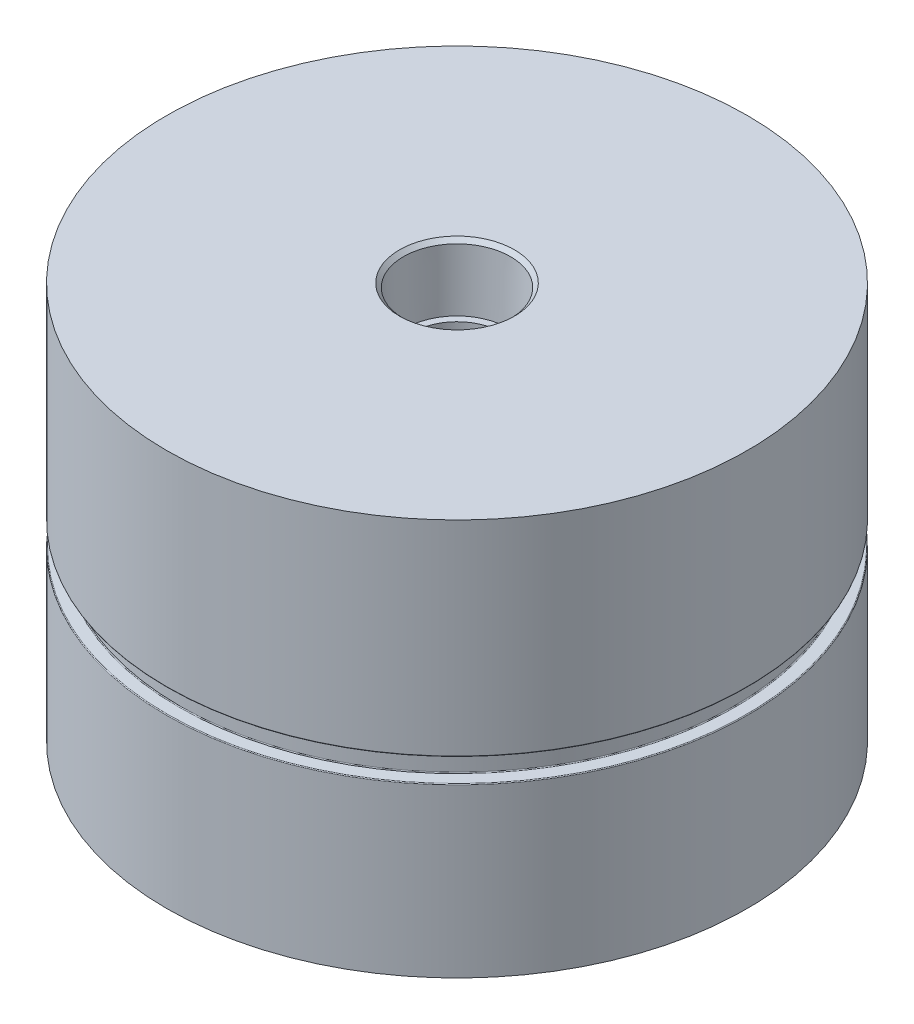
ISO-10303-21;
HEADER;
FILE_DESCRIPTION(('STEP AP214'),'2;1');
FILE_NAME('part.step','',(''),(''),'','','');
FILE_SCHEMA(('AUTOMOTIVE_DESIGN { 1 0 10303 214 1 1 1 1 }'));
ENDSEC;
DATA;
#1=APPLICATION_CONTEXT('core data for automotive mechanical design processes');
#2=APPLICATION_PROTOCOL_DEFINITION('international standard','automotive_design',2000,#1);
#3=PRODUCT_CONTEXT('',#1,'mechanical');
#4=PRODUCT('Part','Part','',(#3));
#5=PRODUCT_RELATED_PRODUCT_CATEGORY('part','',(#4));
#6=PRODUCT_DEFINITION_FORMATION('','',#4);
#7=PRODUCT_DEFINITION_CONTEXT('part definition',#1,'design');
#8=PRODUCT_DEFINITION('design','',#6,#7);
#9=PRODUCT_DEFINITION_SHAPE('','',#8);
#10=(LENGTH_UNIT() NAMED_UNIT(*) SI_UNIT(.MILLI.,.METRE.));
#11=(NAMED_UNIT(*) PLANE_ANGLE_UNIT() SI_UNIT($,.RADIAN.));
#12=(NAMED_UNIT(*) SI_UNIT($,.STERADIAN.) SOLID_ANGLE_UNIT());
#13=UNCERTAINTY_MEASURE_WITH_UNIT(LENGTH_MEASURE(1.E-05),#10,'distance_accuracy_value','');
#14=(GEOMETRIC_REPRESENTATION_CONTEXT(3) GLOBAL_UNCERTAINTY_ASSIGNED_CONTEXT((#13)) GLOBAL_UNIT_ASSIGNED_CONTEXT((#10,
#11,#12)) REPRESENTATION_CONTEXT('',''));
#15=CARTESIAN_POINT('',(0.,0.,0.));
#16=DIRECTION('',(0.,0.,1.));
#17=DIRECTION('',(1.,0.,0.));
#18=AXIS2_PLACEMENT_3D('',#15,#16,#17);
#19=CARTESIAN_POINT('',(0.,-33.4044212771882,0.));
#20=DIRECTION('',(0.,-1.,0.));
#21=DIRECTION('',(0.,0.,-1.));
#22=AXIS2_PLACEMENT_3D('',#19,#20,#21);
#23=PLANE('',#22);
#24=CARTESIAN_POINT('',(0.,-33.4044212771882,0.));
#25=DIRECTION('',(0.,1.,0.));
#26=DIRECTION('',(0.,0.,1.));
#27=AXIS2_PLACEMENT_3D('',#24,#25,#26);
#28=CIRCLE('',#27,7.1374);
#29=CARTESIAN_POINT('',(0.,-33.4044212771882,7.1374));
#30=VERTEX_POINT('',#29);
#31=EDGE_CURVE('E71',#30,#30,#28,.T.);
#32=ORIENTED_EDGE('',*,*,#31,.T.);
#33=EDGE_LOOP('',(#32));
#34=FACE_BOUND('',#33,.T.);
#35=CARTESIAN_POINT('',(0.,-33.4044212771882,0.));
#36=DIRECTION('',(0.,1.,0.));
#37=DIRECTION('',(0.,0.,1.));
#38=AXIS2_PLACEMENT_3D('',#35,#36,#37);
#39=CIRCLE('',#38,46.4693);
#40=CARTESIAN_POINT('',(0.,-33.4044212771882,46.4693));
#41=VERTEX_POINT('',#40);
#42=EDGE_CURVE('E68',#41,#41,#39,.T.);
#43=ORIENTED_EDGE('',*,*,#42,.F.);
#44=EDGE_LOOP('',(#43));
#45=FACE_BOUND('',#44,.T.);
#46=ADVANCED_FACE('F40',(#34,#45),#23,.T.);
#47=CARTESIAN_POINT('',(0.,32.1894098045235,0.));
#48=DIRECTION('',(0.,1.,0.));
#49=DIRECTION('',(0.,0.,1.));
#50=AXIS2_PLACEMENT_3D('',#47,#48,#49);
#51=CYLINDRICAL_SURFACE('',#50,46.4693);
#52=CARTESIAN_POINT('',(0.,-6.64123970800395,0.));
#53=DIRECTION('',(0.,-1.,0.));
#54=DIRECTION('',(0.,0.,-1.));
#55=AXIS2_PLACEMENT_3D('',#52,#53,#54);
#56=CIRCLE('',#55,46.4693);
#57=CARTESIAN_POINT('',(0.,-6.64123970800395,-46.4693));
#58=VERTEX_POINT('',#57);
#59=EDGE_CURVE('E64',#58,#58,#56,.T.);
#60=ORIENTED_EDGE('',*,*,#59,.T.);
#61=EDGE_LOOP('',(#60));
#62=FACE_BOUND('',#61,.T.);
#63=ORIENTED_EDGE('',*,*,#42,.T.);
#64=EDGE_LOOP('',(#63));
#65=FACE_BOUND('',#64,.T.);
#66=ADVANCED_FACE('F112',(#62,#65),#51,.T.);
#67=CARTESIAN_POINT('',(0.,-6.41422860052803,0.));
#68=DIRECTION('',(0.,-1.,0.));
#69=DIRECTION('',(0.,0.,-1.));
#70=AXIS2_PLACEMENT_3D('',#67,#68,#69);
#71=CONICAL_SURFACE('',#70,44.4373,1.51843644923507);
#72=CARTESIAN_POINT('',(0.,-6.42053605146908,0.));
#73=DIRECTION('',(0.,-1.,0.));
#74=DIRECTION('',(0.,0.,-1.));
#75=AXIS2_PLACEMENT_3D('',#72,#73,#74);
#76=CIRCLE('',#75,44.5576533335571);
#77=CARTESIAN_POINT('',(0.,-6.42053605146908,-44.5576533335571));
#78=VERTEX_POINT('',#77);
#79=EDGE_CURVE('E10',#78,#78,#76,.T.);
#80=ORIENTED_EDGE('',*,*,#79,.T.);
#81=EDGE_LOOP('',(#80));
#82=FACE_BOUND('',#81,.T.);
#83=CARTESIAN_POINT('',(0.,-6.51441375709013,0.));
#84=DIRECTION('',(0.,1.,0.));
#85=DIRECTION('',(0.,0.,1.));
#86=AXIS2_PLACEMENT_3D('',#83,#84,#85);
#87=CIRCLE('',#86,46.3489466664429);
#88=CARTESIAN_POINT('',(0.,-6.51441375709013,46.3489466664429));
#89=VERTEX_POINT('',#88);
#90=EDGE_CURVE('E66',#89,#89,#87,.T.);
#91=ORIENTED_EDGE('',*,*,#90,.T.);
#92=EDGE_LOOP('',(#91));
#93=FACE_BOUND('',#92,.T.);
#94=ADVANCED_FACE('F119',(#82,#93),#71,.T.);
#95=CARTESIAN_POINT('',(0.,32.1894098045235,0.));
#96=DIRECTION('',(0.,1.,0.));
#97=DIRECTION('',(0.,0.,1.));
#98=AXIS2_PLACEMENT_3D('',#95,#96,#97);
#99=CYLINDRICAL_SURFACE('',#98,44.4373);
#100=CARTESIAN_POINT('',(0.,-2.97874710050082,0.));
#101=DIRECTION('',(0.,1.,0.));
#102=DIRECTION('',(0.,0.,1.));
#103=AXIS2_PLACEMENT_3D('',#100,#101,#102);
#104=CIRCLE('',#103,44.4373);
#105=CARTESIAN_POINT('',(0.,-2.97874710050082,44.4373));
#106=VERTEX_POINT('',#105);
#107=EDGE_CURVE('E42',#106,#106,#104,.F.);
#108=ORIENTED_EDGE('',*,*,#107,.T.);
#109=EDGE_LOOP('',(#108));
#110=FACE_BOUND('',#109,.T.);
#111=CARTESIAN_POINT('',(0.,-6.29371010055524,0.));
#112=DIRECTION('',(0.,1.,0.));
#113=DIRECTION('',(0.,0.,1.));
#114=AXIS2_PLACEMENT_3D('',#111,#112,#113);
#115=CIRCLE('',#114,44.4373);
#116=CARTESIAN_POINT('',(0.,-6.29371010055524,44.4373));
#117=VERTEX_POINT('',#116);
#118=EDGE_CURVE('E48',#117,#117,#115,.T.);
#119=ORIENTED_EDGE('',*,*,#118,.T.);
#120=EDGE_LOOP('',(#119));
#121=FACE_BOUND('',#120,.T.);
#122=ADVANCED_FACE('F109',(#110,#121),#99,.T.);
#123=CARTESIAN_POINT('',(0.,-2.7517359930249,0.));
#124=DIRECTION('',(0.,1.,0.));
#125=DIRECTION('',(0.,0.,1.));
#126=AXIS2_PLACEMENT_3D('',#123,#124,#125);
#127=CONICAL_SURFACE('',#126,46.4693,1.51843644923507);
#128=CARTESIAN_POINT('',(0.,-2.8519211495871,0.));
#129=DIRECTION('',(0.,1.,0.));
#130=DIRECTION('',(0.,0.,1.));
#131=AXIS2_PLACEMENT_3D('',#128,#129,#130);
#132=CIRCLE('',#131,44.5576533335571);
#133=CARTESIAN_POINT('',(0.,-2.8519211495871,44.5576533335571));
#134=VERTEX_POINT('',#133);
#135=EDGE_CURVE('E55',#134,#134,#132,.T.);
#136=ORIENTED_EDGE('',*,*,#135,.T.);
#137=EDGE_LOOP('',(#136));
#138=FACE_BOUND('',#137,.T.);
#139=CARTESIAN_POINT('',(0.,-2.75804344396594,0.));
#140=DIRECTION('',(0.,-1.,0.));
#141=DIRECTION('',(0.,0.,-1.));
#142=AXIS2_PLACEMENT_3D('',#139,#140,#141);
#143=CIRCLE('',#142,46.3489466664428);
#144=CARTESIAN_POINT('',(0.,-2.75804344396594,-46.3489466664428));
#145=VERTEX_POINT('',#144);
#146=EDGE_CURVE('E60',#145,#145,#143,.T.);
#147=ORIENTED_EDGE('',*,*,#146,.T.);
#148=EDGE_LOOP('',(#147));
#149=FACE_BOUND('',#148,.T.);
#150=ADVANCED_FACE('F105',(#138,#149),#127,.T.);
#151=CARTESIAN_POINT('',(0.,32.1894098045235,0.));
#152=DIRECTION('',(0.,1.,0.));
#153=DIRECTION('',(0.,0.,1.));
#154=AXIS2_PLACEMENT_3D('',#151,#152,#153);
#155=CYLINDRICAL_SURFACE('',#154,46.4693);
#156=CARTESIAN_POINT('',(0.,-2.6312174930521,0.));
#157=DIRECTION('',(0.,-1.,0.));
#158=DIRECTION('',(0.,0.,-1.));
#159=AXIS2_PLACEMENT_3D('',#156,#157,#158);
#160=CIRCLE('',#159,46.4693);
#161=CARTESIAN_POINT('',(0.,-2.6312174930521,-46.4693));
#162=VERTEX_POINT('',#161);
#163=EDGE_CURVE('E58',#162,#162,#160,.F.);
#164=ORIENTED_EDGE('',*,*,#163,.T.);
#165=EDGE_LOOP('',(#164));
#166=FACE_BOUND('',#165,.T.);
#167=CARTESIAN_POINT('',(0.,30.0955787228118,0.));
#168=DIRECTION('',(0.,1.,0.));
#169=DIRECTION('',(0.,0.,1.));
#170=AXIS2_PLACEMENT_3D('',#167,#168,#169);
#171=CIRCLE('',#170,46.4693);
#172=CARTESIAN_POINT('',(0.,30.0955787228118,46.4693));
#173=VERTEX_POINT('',#172);
#174=EDGE_CURVE('E75',#173,#173,#171,.T.);
#175=ORIENTED_EDGE('',*,*,#174,.F.);
#176=EDGE_LOOP('',(#175));
#177=FACE_BOUND('',#176,.T.);
#178=ADVANCED_FACE('F97',(#166,#177),#155,.T.);
#179=CARTESIAN_POINT('',(-46.4693,30.0955787228118,0.));
#180=DIRECTION('',(0.,1.,0.));
#181=DIRECTION('',(0.,0.,1.));
#182=AXIS2_PLACEMENT_3D('',#179,#180,#181);
#183=PLANE('',#182);
#184=CARTESIAN_POINT('',(0.,30.0955787228118,0.));
#185=DIRECTION('',(0.,1.,0.));
#186=DIRECTION('',(0.,0.,1.));
#187=AXIS2_PLACEMENT_3D('',#184,#185,#186);
#188=CIRCLE('',#187,9.2075);
#189=CARTESIAN_POINT('',(0.,30.0955787228118,9.2075));
#190=VERTEX_POINT('',#189);
#191=EDGE_CURVE('E90',#190,#190,#188,.T.);
#192=ORIENTED_EDGE('',*,*,#191,.F.);
#193=EDGE_LOOP('',(#192));
#194=FACE_BOUND('',#193,.T.);
#195=ORIENTED_EDGE('',*,*,#174,.T.);
#196=EDGE_LOOP('',(#195));
#197=FACE_BOUND('',#196,.T.);
#198=ADVANCED_FACE('F93',(#194,#197),#183,.T.);
#199=CARTESIAN_POINT('',(0.,-6.64123970800396,0.));
#200=DIRECTION('',(0.,-1.,0.));
#201=DIRECTION('',(0.,0.,-1.));
#202=AXIS2_PLACEMENT_3D('',#199,#200,#201);
#203=TOROIDAL_SURFACE('',#202,46.3423,0.127);
#204=ORIENTED_EDGE('',*,*,#59,.F.);
#205=EDGE_LOOP('',(#204));
#206=FACE_BOUND('',#205,.T.);
#207=ORIENTED_EDGE('',*,*,#90,.F.);
#208=EDGE_LOOP('',(#207));
#209=FACE_BOUND('',#208,.T.);
#210=ADVANCED_FACE('F98',(#206,#209),#203,.T.);
#211=CARTESIAN_POINT('',(0.,-2.6312174930521,0.));
#212=DIRECTION('',(0.,-1.,0.));
#213=DIRECTION('',(0.,0.,-1.));
#214=AXIS2_PLACEMENT_3D('',#211,#212,#213);
#215=TOROIDAL_SURFACE('',#214,46.3423,0.127);
#216=ORIENTED_EDGE('',*,*,#146,.F.);
#217=EDGE_LOOP('',(#216));
#218=FACE_BOUND('',#217,.T.);
#219=ORIENTED_EDGE('',*,*,#163,.F.);
#220=EDGE_LOOP('',(#219));
#221=FACE_BOUND('',#220,.T.);
#222=ADVANCED_FACE('F130',(#218,#221),#215,.T.);
#223=CARTESIAN_POINT('',(0.,-2.97874710050082,0.));
#224=DIRECTION('',(0.,1.,0.));
#225=DIRECTION('',(0.,0.,1.));
#226=AXIS2_PLACEMENT_3D('',#223,#224,#225);
#227=TOROIDAL_SURFACE('',#226,44.5643,0.127);
#228=ORIENTED_EDGE('',*,*,#107,.F.);
#229=EDGE_LOOP('',(#228));
#230=FACE_BOUND('',#229,.T.);
#231=ORIENTED_EDGE('',*,*,#135,.F.);
#232=EDGE_LOOP('',(#231));
#233=FACE_BOUND('',#232,.T.);
#234=ADVANCED_FACE('F128',(#230,#233),#227,.F.);
#235=CARTESIAN_POINT('',(0.,-6.29371010055524,0.));
#236=DIRECTION('',(0.,1.,0.));
#237=DIRECTION('',(0.,0.,1.));
#238=AXIS2_PLACEMENT_3D('',#235,#236,#237);
#239=TOROIDAL_SURFACE('',#238,44.5643,0.127);
#240=ORIENTED_EDGE('',*,*,#79,.F.);
#241=EDGE_LOOP('',(#240));
#242=FACE_BOUND('',#241,.T.);
#243=ORIENTED_EDGE('',*,*,#118,.F.);
#244=EDGE_LOOP('',(#243));
#245=FACE_BOUND('',#244,.T.);
#246=ADVANCED_FACE('F39',(#242,#245),#239,.F.);
#247=CARTESIAN_POINT('',(0.,30.0955787228118,0.));
#248=DIRECTION('',(0.,1.,0.));
#249=DIRECTION('',(0.,0.,1.));
#250=AXIS2_PLACEMENT_3D('',#247,#248,#249);
#251=CYLINDRICAL_SURFACE('',#250,7.1374);
#252=ORIENTED_EDGE('',*,*,#31,.F.);
#253=EDGE_LOOP('',(#252));
#254=FACE_BOUND('',#253,.T.);
#255=CARTESIAN_POINT('',(0.,19.6815787228118,0.));
#256=DIRECTION('',(0.,1.,0.));
#257=DIRECTION('',(0.,0.,1.));
#258=AXIS2_PLACEMENT_3D('',#255,#256,#257);
#259=CIRCLE('',#258,7.13740000000001);
#260=CARTESIAN_POINT('',(0.,19.6815787228118,7.13740000000001));
#261=VERTEX_POINT('',#260);
#262=EDGE_CURVE('E76',#261,#261,#259,.T.);
#263=ORIENTED_EDGE('',*,*,#262,.T.);
#264=EDGE_LOOP('',(#263));
#265=FACE_BOUND('',#264,.T.);
#266=ADVANCED_FACE('F137',(#254,#265),#251,.F.);
#267=CARTESIAN_POINT('',(7.13740000000001,19.6815787228118,0.));
#268=DIRECTION('',(0.,-1.,0.));
#269=DIRECTION('',(0.,0.,-1.));
#270=AXIS2_PLACEMENT_3D('',#267,#268,#269);
#271=PLANE('',#270);
#272=ORIENTED_EDGE('',*,*,#262,.F.);
#273=EDGE_LOOP('',(#272));
#274=FACE_BOUND('',#273,.T.);
#275=CARTESIAN_POINT('',(0.,19.6815787228118,0.));
#276=DIRECTION('',(0.,1.,0.));
#277=DIRECTION('',(0.,0.,1.));
#278=AXIS2_PLACEMENT_3D('',#275,#276,#277);
#279=CIRCLE('',#278,8.26974156051022);
#280=CARTESIAN_POINT('',(0.,19.6815787228118,8.26974156051022));
#281=VERTEX_POINT('',#280);
#282=EDGE_CURVE('E82',#281,#281,#279,.T.);
#283=ORIENTED_EDGE('',*,*,#282,.T.);
#284=EDGE_LOOP('',(#283));
#285=FACE_BOUND('',#284,.T.);
#286=ADVANCED_FACE('F150',(#274,#285),#271,.F.);
#287=CARTESIAN_POINT('',(0.,29.4631949228118,0.));
#288=DIRECTION('',(0.,1.,0.));
#289=DIRECTION('',(0.,0.,1.));
#290=AXIS2_PLACEMENT_3D('',#287,#288,#289);
#291=CONICAL_SURFACE('',#290,8.5751162,0.0312091050195372);
#292=ORIENTED_EDGE('',*,*,#282,.F.);
#293=EDGE_LOOP('',(#292));
#294=FACE_BOUND('',#293,.T.);
#295=CARTESIAN_POINT('',(0.,29.4631949228118,0.));
#296=DIRECTION('',(0.,1.,0.));
#297=DIRECTION('',(0.,0.,1.));
#298=AXIS2_PLACEMENT_3D('',#295,#296,#297);
#299=CIRCLE('',#298,8.5751162);
#300=CARTESIAN_POINT('',(0.,29.4631949228118,8.5751162));
#301=VERTEX_POINT('',#300);
#302=EDGE_CURVE('E81',#301,#301,#299,.T.);
#303=ORIENTED_EDGE('',*,*,#302,.T.);
#304=EDGE_LOOP('',(#303));
#305=FACE_BOUND('',#304,.T.);
#306=ADVANCED_FACE('F220',(#294,#305),#291,.F.);
#307=CARTESIAN_POINT('',(0.,30.0955787228118,0.));
#308=DIRECTION('',(0.,1.,0.));
#309=DIRECTION('',(0.,0.,1.));
#310=AXIS2_PLACEMENT_3D('',#307,#308,#309);
#311=CONICAL_SURFACE('',#310,9.2075,0.785398163397451);
#312=ORIENTED_EDGE('',*,*,#302,.F.);
#313=EDGE_LOOP('',(#312));
#314=FACE_BOUND('',#313,.T.);
#315=ORIENTED_EDGE('',*,*,#191,.T.);
#316=EDGE_LOOP('',(#315));
#317=FACE_BOUND('',#316,.T.);
#318=ADVANCED_FACE('F92',(#314,#317),#311,.F.);
#319=CLOSED_SHELL('',(#46,#66,#94,#122,#150,#178,#198,#210,#222,#234,#246,#266,#286,#306,#318));
#320=MANIFOLD_SOLID_BREP('B2',#319);
#321=ADVANCED_BREP_SHAPE_REPRESENTATION('',(#18,#320),#14);
#322=SHAPE_DEFINITION_REPRESENTATION(#9,#321);
ENDSEC;
END-ISO-10303-21;
